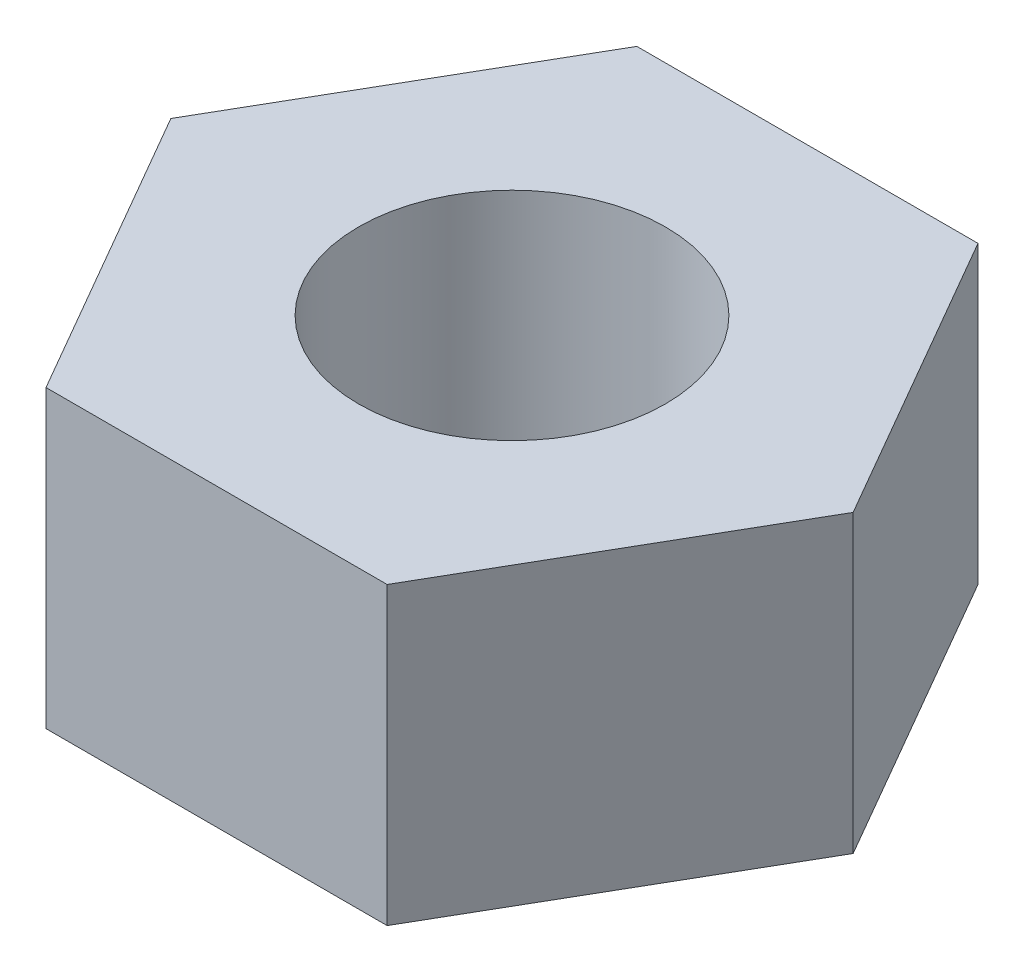
ISO-10303-21;
HEADER;
FILE_DESCRIPTION(('STEP AP214'),'2;1');
FILE_NAME('part.step','',(''),(''),'','','');
FILE_SCHEMA(('AUTOMOTIVE_DESIGN { 1 0 10303 214 1 1 1 1 }'));
ENDSEC;
DATA;
#1=APPLICATION_CONTEXT('core data for automotive mechanical design processes');
#2=APPLICATION_PROTOCOL_DEFINITION('international standard','automotive_design',2000,#1);
#3=PRODUCT_CONTEXT('',#1,'mechanical');
#4=PRODUCT('Part','Part','',(#3));
#5=PRODUCT_RELATED_PRODUCT_CATEGORY('part','',(#4));
#6=PRODUCT_DEFINITION_FORMATION('','',#4);
#7=PRODUCT_DEFINITION_CONTEXT('part definition',#1,'design');
#8=PRODUCT_DEFINITION('design','',#6,#7);
#9=PRODUCT_DEFINITION_SHAPE('','',#8);
#10=(LENGTH_UNIT() NAMED_UNIT(*) SI_UNIT(.MILLI.,.METRE.));
#11=(NAMED_UNIT(*) PLANE_ANGLE_UNIT() SI_UNIT($,.RADIAN.));
#12=(NAMED_UNIT(*) SI_UNIT($,.STERADIAN.) SOLID_ANGLE_UNIT());
#13=UNCERTAINTY_MEASURE_WITH_UNIT(LENGTH_MEASURE(1.E-05),#10,'distance_accuracy_value','');
#14=(GEOMETRIC_REPRESENTATION_CONTEXT(3) GLOBAL_UNCERTAINTY_ASSIGNED_CONTEXT((#13)) GLOBAL_UNIT_ASSIGNED_CONTEXT((#10,
#11,#12)) REPRESENTATION_CONTEXT('',''));
#15=CARTESIAN_POINT('',(0.,0.,0.));
#16=DIRECTION('',(0.,0.,1.));
#17=DIRECTION('',(1.,0.,0.));
#18=AXIS2_PLACEMENT_3D('',#15,#16,#17);
#19=CARTESIAN_POINT('',(-3.75277674973256,6.5,-6.5));
#20=DIRECTION('',(0.,1.,0.));
#21=DIRECTION('',(0.,0.,1.));
#22=AXIS2_PLACEMENT_3D('',#19,#20,#21);
#23=PLANE('',#22);
#24=DIRECTION('',(-1.,0.,0.));
#25=VECTOR('',#24,1.);
#26=CARTESIAN_POINT('',(3.75277674973257,6.5,-6.5));
#27=LINE('',#26,#25);
#28=CARTESIAN_POINT('',(3.75277674973257,6.5,-6.5));
#29=VERTEX_POINT('',#28);
#30=CARTESIAN_POINT('',(-3.75277674973256,6.5,-6.5));
#31=VERTEX_POINT('',#30);
#32=EDGE_CURVE('E130',#29,#31,#27,.T.);
#33=ORIENTED_EDGE('',*,*,#32,.T.);
#34=DIRECTION('',(-0.5,0.,0.866025403784439));
#35=VECTOR('',#34,1.);
#36=CARTESIAN_POINT('',(-3.75277674973256,6.5,-6.5));
#37=LINE('',#36,#35);
#38=CARTESIAN_POINT('',(-7.50555349946513,6.5,0.));
#39=VERTEX_POINT('',#38);
#40=EDGE_CURVE('E88',#31,#39,#37,.T.);
#41=ORIENTED_EDGE('',*,*,#40,.T.);
#42=DIRECTION('',(0.5,0.,0.866025403784439));
#43=VECTOR('',#42,1.);
#44=CARTESIAN_POINT('',(-7.50555349946513,6.5,0.));
#45=LINE('',#44,#43);
#46=CARTESIAN_POINT('',(-3.75277674973257,6.5,6.5));
#47=VERTEX_POINT('',#46);
#48=EDGE_CURVE('E101',#39,#47,#45,.T.);
#49=ORIENTED_EDGE('',*,*,#48,.T.);
#50=DIRECTION('',(1.,0.,0.));
#51=VECTOR('',#50,1.);
#52=CARTESIAN_POINT('',(-3.75277674973257,6.5,6.5));
#53=LINE('',#52,#51);
#54=CARTESIAN_POINT('',(3.75277674973257,6.5,6.5));
#55=VERTEX_POINT('',#54);
#56=EDGE_CURVE('E95',#47,#55,#53,.T.);
#57=ORIENTED_EDGE('',*,*,#56,.T.);
#58=DIRECTION('',(0.5,0.,-0.866025403784439));
#59=VECTOR('',#58,1.);
#60=CARTESIAN_POINT('',(3.75277674973257,6.5,6.5));
#61=LINE('',#60,#59);
#62=CARTESIAN_POINT('',(7.50555349946514,6.5,0.));
#63=VERTEX_POINT('',#62);
#64=EDGE_CURVE('E99',#55,#63,#61,.T.);
#65=ORIENTED_EDGE('',*,*,#64,.T.);
#66=DIRECTION('',(-0.5,0.,-0.866025403784439));
#67=VECTOR('',#66,1.);
#68=CARTESIAN_POINT('',(7.50555349946514,6.5,0.));
#69=LINE('',#68,#67);
#70=EDGE_CURVE('E51',#63,#29,#69,.T.);
#71=ORIENTED_EDGE('',*,*,#70,.T.);
#72=EDGE_LOOP('',(#33,#41,#49,#57,#65,#71));
#73=FACE_BOUND('',#72,.T.);
#74=CARTESIAN_POINT('',(0.,6.5,0.));
#75=DIRECTION('',(0.,1.,0.));
#76=DIRECTION('',(0.,0.,1.));
#77=AXIS2_PLACEMENT_3D('',#74,#75,#76);
#78=CIRCLE('',#77,3.375);
#79=CARTESIAN_POINT('',(0.,6.5,-3.375));
#80=VERTEX_POINT('',#79);
#81=EDGE_CURVE('E123',#80,#80,#78,.T.);
#82=ORIENTED_EDGE('',*,*,#81,.F.);
#83=EDGE_LOOP('',(#82));
#84=FACE_BOUND('',#83,.T.);
#85=ADVANCED_FACE('F34',(#73,#84),#23,.T.);
#86=CARTESIAN_POINT('',(-3.75277674973256,0.,-6.5));
#87=DIRECTION('',(0.,1.,0.));
#88=DIRECTION('',(0.,0.,1.));
#89=AXIS2_PLACEMENT_3D('',#86,#87,#88);
#90=PLANE('',#89);
#91=DIRECTION('',(-1.,0.,0.));
#92=VECTOR('',#91,1.);
#93=CARTESIAN_POINT('',(3.75277674973257,0.,-6.5));
#94=LINE('',#93,#92);
#95=CARTESIAN_POINT('',(3.75277674973257,0.,-6.5));
#96=VERTEX_POINT('',#95);
#97=CARTESIAN_POINT('',(-3.75277674973256,0.,-6.5));
#98=VERTEX_POINT('',#97);
#99=EDGE_CURVE('E119',#96,#98,#94,.T.);
#100=ORIENTED_EDGE('',*,*,#99,.F.);
#101=DIRECTION('',(-0.5,0.,-0.866025403784439));
#102=VECTOR('',#101,1.);
#103=CARTESIAN_POINT('',(7.50555349946514,0.,0.));
#104=LINE('',#103,#102);
#105=CARTESIAN_POINT('',(7.50555349946514,0.,0.));
#106=VERTEX_POINT('',#105);
#107=EDGE_CURVE('E80',#106,#96,#104,.T.);
#108=ORIENTED_EDGE('',*,*,#107,.F.);
#109=DIRECTION('',(0.5,0.,-0.866025403784439));
#110=VECTOR('',#109,1.);
#111=CARTESIAN_POINT('',(3.75277674973257,0.,6.5));
#112=LINE('',#111,#110);
#113=CARTESIAN_POINT('',(3.75277674973257,0.,6.5));
#114=VERTEX_POINT('',#113);
#115=EDGE_CURVE('E74',#114,#106,#112,.T.);
#116=ORIENTED_EDGE('',*,*,#115,.F.);
#117=DIRECTION('',(1.,0.,0.));
#118=VECTOR('',#117,1.);
#119=CARTESIAN_POINT('',(-3.75277674973257,0.,6.5));
#120=LINE('',#119,#118);
#121=CARTESIAN_POINT('',(-3.75277674973257,0.,6.5));
#122=VERTEX_POINT('',#121);
#123=EDGE_CURVE('E109',#122,#114,#120,.T.);
#124=ORIENTED_EDGE('',*,*,#123,.F.);
#125=DIRECTION('',(0.5,0.,0.866025403784439));
#126=VECTOR('',#125,1.);
#127=CARTESIAN_POINT('',(-7.50555349946513,0.,0.));
#128=LINE('',#127,#126);
#129=CARTESIAN_POINT('',(-7.50555349946513,0.,0.));
#130=VERTEX_POINT('',#129);
#131=EDGE_CURVE('E125',#130,#122,#128,.T.);
#132=ORIENTED_EDGE('',*,*,#131,.F.);
#133=DIRECTION('',(-0.5,0.,0.866025403784439));
#134=VECTOR('',#133,1.);
#135=CARTESIAN_POINT('',(-3.75277674973256,0.,-6.5));
#136=LINE('',#135,#134);
#137=EDGE_CURVE('E122',#98,#130,#136,.T.);
#138=ORIENTED_EDGE('',*,*,#137,.F.);
#139=EDGE_LOOP('',(#100,#108,#116,#124,#132,#138));
#140=FACE_BOUND('',#139,.T.);
#141=CARTESIAN_POINT('',(0.,0.,0.));
#142=DIRECTION('',(0.,1.,0.));
#143=DIRECTION('',(0.,0.,1.));
#144=AXIS2_PLACEMENT_3D('',#141,#142,#143);
#145=CIRCLE('',#144,3.375);
#146=CARTESIAN_POINT('',(0.,0.,-3.375));
#147=VERTEX_POINT('',#146);
#148=EDGE_CURVE('E223',#147,#147,#145,.T.);
#149=ORIENTED_EDGE('',*,*,#148,.T.);
#150=EDGE_LOOP('',(#149));
#151=FACE_BOUND('',#150,.T.);
#152=ADVANCED_FACE('F139',(#140,#151),#90,.F.);
#153=CARTESIAN_POINT('',(3.75277674973257,6.5,-6.5));
#154=DIRECTION('',(0.,0.,1.));
#155=DIRECTION('',(1.,0.,0.));
#156=AXIS2_PLACEMENT_3D('',#153,#154,#155);
#157=PLANE('',#156);
#158=ORIENTED_EDGE('',*,*,#99,.T.);
#159=DIRECTION('',(0.,-1.,0.));
#160=VECTOR('',#159,1.);
#161=CARTESIAN_POINT('',(-3.75277674973256,6.5,-6.5));
#162=LINE('',#161,#160);
#163=EDGE_CURVE('E11',#31,#98,#162,.T.);
#164=ORIENTED_EDGE('',*,*,#163,.F.);
#165=ORIENTED_EDGE('',*,*,#32,.F.);
#166=DIRECTION('',(0.,-1.,0.));
#167=VECTOR('',#166,1.);
#168=CARTESIAN_POINT('',(3.75277674973257,6.5,-6.5));
#169=LINE('',#168,#167);
#170=EDGE_CURVE('E115',#29,#96,#169,.T.);
#171=ORIENTED_EDGE('',*,*,#170,.T.);
#172=EDGE_LOOP('',(#158,#164,#165,#171));
#173=FACE_BOUND('',#172,.T.);
#174=ADVANCED_FACE('F36',(#173),#157,.F.);
#175=CARTESIAN_POINT('',(-3.75277674973256,6.5,-6.5));
#176=DIRECTION('',(0.866025403784438,0.,0.5));
#177=DIRECTION('',(0.5,0.,-0.866025403784439));
#178=AXIS2_PLACEMENT_3D('',#175,#176,#177);
#179=PLANE('',#178);
#180=ORIENTED_EDGE('',*,*,#137,.T.);
#181=DIRECTION('',(0.,-1.,0.));
#182=VECTOR('',#181,1.);
#183=CARTESIAN_POINT('',(-7.50555349946513,6.5,0.));
#184=LINE('',#183,#182);
#185=EDGE_CURVE('E43',#39,#130,#184,.T.);
#186=ORIENTED_EDGE('',*,*,#185,.F.);
#187=ORIENTED_EDGE('',*,*,#40,.F.);
#188=ORIENTED_EDGE('',*,*,#163,.T.);
#189=EDGE_LOOP('',(#180,#186,#187,#188));
#190=FACE_BOUND('',#189,.T.);
#191=ADVANCED_FACE('F164',(#190),#179,.F.);
#192=CARTESIAN_POINT('',(-7.50555349946513,6.5,0.));
#193=DIRECTION('',(0.866025403784439,0.,-0.5));
#194=DIRECTION('',(-0.5,0.,-0.866025403784439));
#195=AXIS2_PLACEMENT_3D('',#192,#193,#194);
#196=PLANE('',#195);
#197=ORIENTED_EDGE('',*,*,#131,.T.);
#198=DIRECTION('',(0.,-1.,0.));
#199=VECTOR('',#198,1.);
#200=CARTESIAN_POINT('',(-3.75277674973257,6.5,6.5));
#201=LINE('',#200,#199);
#202=EDGE_CURVE('E110',#47,#122,#201,.T.);
#203=ORIENTED_EDGE('',*,*,#202,.F.);
#204=ORIENTED_EDGE('',*,*,#48,.F.);
#205=ORIENTED_EDGE('',*,*,#185,.T.);
#206=EDGE_LOOP('',(#197,#203,#204,#205));
#207=FACE_BOUND('',#206,.T.);
#208=ADVANCED_FACE('F136',(#207),#196,.F.);
#209=CARTESIAN_POINT('',(-3.75277674973257,6.5,6.5));
#210=DIRECTION('',(0.,0.,-1.));
#211=DIRECTION('',(-1.,0.,0.));
#212=AXIS2_PLACEMENT_3D('',#209,#210,#211);
#213=PLANE('',#212);
#214=ORIENTED_EDGE('',*,*,#123,.T.);
#215=DIRECTION('',(0.,-1.,0.));
#216=VECTOR('',#215,1.);
#217=CARTESIAN_POINT('',(3.75277674973257,6.5,6.5));
#218=LINE('',#217,#216);
#219=EDGE_CURVE('E106',#55,#114,#218,.T.);
#220=ORIENTED_EDGE('',*,*,#219,.F.);
#221=ORIENTED_EDGE('',*,*,#56,.F.);
#222=ORIENTED_EDGE('',*,*,#202,.T.);
#223=EDGE_LOOP('',(#214,#220,#221,#222));
#224=FACE_BOUND('',#223,.T.);
#225=ADVANCED_FACE('F107',(#224),#213,.F.);
#226=CARTESIAN_POINT('',(3.75277674973257,6.5,6.5));
#227=DIRECTION('',(-0.866025403784439,0.,-0.5));
#228=DIRECTION('',(-0.5,0.,0.866025403784439));
#229=AXIS2_PLACEMENT_3D('',#226,#227,#228);
#230=PLANE('',#229);
#231=ORIENTED_EDGE('',*,*,#115,.T.);
#232=DIRECTION('',(0.,-1.,0.));
#233=VECTOR('',#232,1.);
#234=CARTESIAN_POINT('',(7.50555349946514,6.5,0.));
#235=LINE('',#234,#233);
#236=EDGE_CURVE('E111',#63,#106,#235,.T.);
#237=ORIENTED_EDGE('',*,*,#236,.F.);
#238=ORIENTED_EDGE('',*,*,#64,.F.);
#239=ORIENTED_EDGE('',*,*,#219,.T.);
#240=EDGE_LOOP('',(#231,#237,#238,#239));
#241=FACE_BOUND('',#240,.T.);
#242=ADVANCED_FACE('F113',(#241),#230,.F.);
#243=CARTESIAN_POINT('',(7.50555349946514,6.5,0.));
#244=DIRECTION('',(-0.866025403784439,0.,0.5));
#245=DIRECTION('',(0.5,0.,0.866025403784439));
#246=AXIS2_PLACEMENT_3D('',#243,#244,#245);
#247=PLANE('',#246);
#248=ORIENTED_EDGE('',*,*,#107,.T.);
#249=ORIENTED_EDGE('',*,*,#170,.F.);
#250=ORIENTED_EDGE('',*,*,#70,.F.);
#251=ORIENTED_EDGE('',*,*,#236,.T.);
#252=EDGE_LOOP('',(#248,#249,#250,#251));
#253=FACE_BOUND('',#252,.T.);
#254=ADVANCED_FACE('F144',(#253),#247,.F.);
#255=CARTESIAN_POINT('',(0.,6.5,0.));
#256=DIRECTION('',(0.,-1.,0.));
#257=DIRECTION('',(0.,0.,-1.));
#258=AXIS2_PLACEMENT_3D('',#255,#256,#257);
#259=CYLINDRICAL_SURFACE('',#258,3.375);
#260=CARTESIAN_POINT('',(0.,6.5,-3.375));
#261=CARTESIAN_POINT('',(0.,6.43229166666667,-3.375));
#262=CARTESIAN_POINT('',(0.,6.36458333333333,-3.375));
#263=CARTESIAN_POINT('',(0.,6.22916666666667,-3.375));
#264=CARTESIAN_POINT('',(0.,6.16145833333333,-3.375));
#265=CARTESIAN_POINT('',(0.,6.02604166666667,-3.375));
#266=CARTESIAN_POINT('',(0.,5.95833333333333,-3.375));
#267=CARTESIAN_POINT('',(0.,5.82291666666667,-3.375));
#268=CARTESIAN_POINT('',(0.,5.75520833333333,-3.375));
#269=CARTESIAN_POINT('',(0.,5.61979166666667,-3.375));
#270=CARTESIAN_POINT('',(0.,5.55208333333333,-3.375));
#271=CARTESIAN_POINT('',(0.,5.41666666666667,-3.375));
#272=CARTESIAN_POINT('',(0.,5.34895833333333,-3.375));
#273=CARTESIAN_POINT('',(0.,5.21354166666667,-3.375));
#274=CARTESIAN_POINT('',(0.,5.14583333333333,-3.375));
#275=CARTESIAN_POINT('',(0.,5.01041666666667,-3.375));
#276=CARTESIAN_POINT('',(0.,4.94270833333333,-3.375));
#277=CARTESIAN_POINT('',(0.,4.80729166666667,-3.375));
#278=CARTESIAN_POINT('',(0.,4.73958333333333,-3.375));
#279=CARTESIAN_POINT('',(0.,4.60416666666667,-3.375));
#280=CARTESIAN_POINT('',(0.,4.53645833333333,-3.375));
#281=CARTESIAN_POINT('',(0.,4.40104166666667,-3.375));
#282=CARTESIAN_POINT('',(0.,4.33333333333333,-3.375));
#283=CARTESIAN_POINT('',(0.,4.19791666666667,-3.375));
#284=CARTESIAN_POINT('',(0.,4.13020833333333,-3.375));
#285=CARTESIAN_POINT('',(0.,3.99479166666667,-3.375));
#286=CARTESIAN_POINT('',(0.,3.92708333333333,-3.375));
#287=CARTESIAN_POINT('',(0.,3.79166666666667,-3.375));
#288=CARTESIAN_POINT('',(0.,3.72395833333333,-3.375));
#289=CARTESIAN_POINT('',(0.,3.58854166666667,-3.375));
#290=CARTESIAN_POINT('',(0.,3.52083333333333,-3.375));
#291=CARTESIAN_POINT('',(0.,3.38541666666667,-3.375));
#292=CARTESIAN_POINT('',(0.,3.31770833333333,-3.375));
#293=CARTESIAN_POINT('',(0.,3.18229166666667,-3.375));
#294=CARTESIAN_POINT('',(0.,3.11458333333333,-3.375));
#295=CARTESIAN_POINT('',(0.,2.97916666666667,-3.375));
#296=CARTESIAN_POINT('',(0.,2.91145833333333,-3.375));
#297=CARTESIAN_POINT('',(0.,2.77604166666667,-3.375));
#298=CARTESIAN_POINT('',(0.,2.70833333333333,-3.375));
#299=CARTESIAN_POINT('',(0.,2.57291666666667,-3.375));
#300=CARTESIAN_POINT('',(0.,2.50520833333333,-3.375));
#301=CARTESIAN_POINT('',(0.,2.36979166666667,-3.375));
#302=CARTESIAN_POINT('',(0.,2.30208333333333,-3.375));
#303=CARTESIAN_POINT('',(0.,2.16666666666667,-3.375));
#304=CARTESIAN_POINT('',(0.,2.09895833333333,-3.375));
#305=CARTESIAN_POINT('',(0.,1.96354166666667,-3.375));
#306=CARTESIAN_POINT('',(0.,1.89583333333333,-3.375));
#307=CARTESIAN_POINT('',(0.,1.76041666666667,-3.375));
#308=CARTESIAN_POINT('',(0.,1.69270833333333,-3.375));
#309=CARTESIAN_POINT('',(0.,1.55729166666667,-3.375));
#310=CARTESIAN_POINT('',(0.,1.48958333333333,-3.375));
#311=CARTESIAN_POINT('',(0.,1.35416666666667,-3.375));
#312=CARTESIAN_POINT('',(0.,1.28645833333333,-3.375));
#313=CARTESIAN_POINT('',(0.,1.15104166666667,-3.375));
#314=CARTESIAN_POINT('',(0.,1.08333333333333,-3.375));
#315=CARTESIAN_POINT('',(0.,0.947916666666667,-3.375));
#316=CARTESIAN_POINT('',(0.,0.880208333333333,-3.375));
#317=CARTESIAN_POINT('',(0.,0.744791666666667,-3.375));
#318=CARTESIAN_POINT('',(0.,0.677083333333333,-3.375));
#319=CARTESIAN_POINT('',(0.,0.541666666666667,-3.375));
#320=CARTESIAN_POINT('',(0.,0.473958333333333,-3.375));
#321=CARTESIAN_POINT('',(0.,0.338541666666667,-3.375));
#322=CARTESIAN_POINT('',(0.,0.270833333333334,-3.375));
#323=CARTESIAN_POINT('',(0.,0.135416666666667,-3.375));
#324=CARTESIAN_POINT('',(0.,0.0677083333333334,-3.375));
#325=CARTESIAN_POINT('',(0.,0.,-3.375));
#326=B_SPLINE_CURVE_WITH_KNOTS('',3,(#260,#261,#262,#263,#264,#265,#266,#267,#268,#269,#270,
#271,#272,#273,#274,#275,#276,#277,#278,#279,#280,#281,#282,#283,#284,#285,#286,#287,#288,#289,
#290,#291,#292,#293,#294,#295,#296,#297,#298,#299,#300,#301,#302,#303,#304,#305,#306,#307,#308,
#309,#310,#311,#312,#313,#314,#315,#316,#317,#318,#319,#320,#321,#322,#323,#324,#325),
.UNSPECIFIED.,.F.,.F.,(4,2,2,2,2,2,2,2,2,2,2,2,2,2,2,2,2,2,2,2,2,2,2,2,2,2,2,2,2,2,2,2,4),(0.,
0.203124999999999,0.40625,0.609375,0.812499999999999,1.015625,1.21875,1.421875,1.625,1.828125,
2.03125,2.234375,2.4375,2.640625,2.84375,3.046875,3.25,3.453125,3.65625,3.859375,4.0625,
4.265625,4.46875,4.671875,4.875,5.078125,5.28125,5.484375,5.6875,5.890625,6.09375,6.296875,6.5),.UNSPECIFIED.);
#327=EDGE_CURVE('BSEAM146',#80,#147,#326,.T.);
#328=ORIENTED_EDGE('',*,*,#81,.T.);
#329=ORIENTED_EDGE('',*,*,#148,.F.);
#330=ORIENTED_EDGE('',*,*,#327,.T.);
#331=ORIENTED_EDGE('',*,*,#327,.F.);
#332=EDGE_LOOP('',(#328,#330,#329,#331));
#333=FACE_BOUND('',#332,.T.);
#334=ADVANCED_FACE('F146',(#333),#259,.F.);
#335=CLOSED_SHELL('',(#85,#152,#174,#191,#208,#225,#242,#254,#334));
#336=MANIFOLD_SOLID_BREP('B2',#335);
#337=ADVANCED_BREP_SHAPE_REPRESENTATION('',(#18,#336),#14);
#338=SHAPE_DEFINITION_REPRESENTATION(#9,#337);
ENDSEC;
END-ISO-10303-21;
